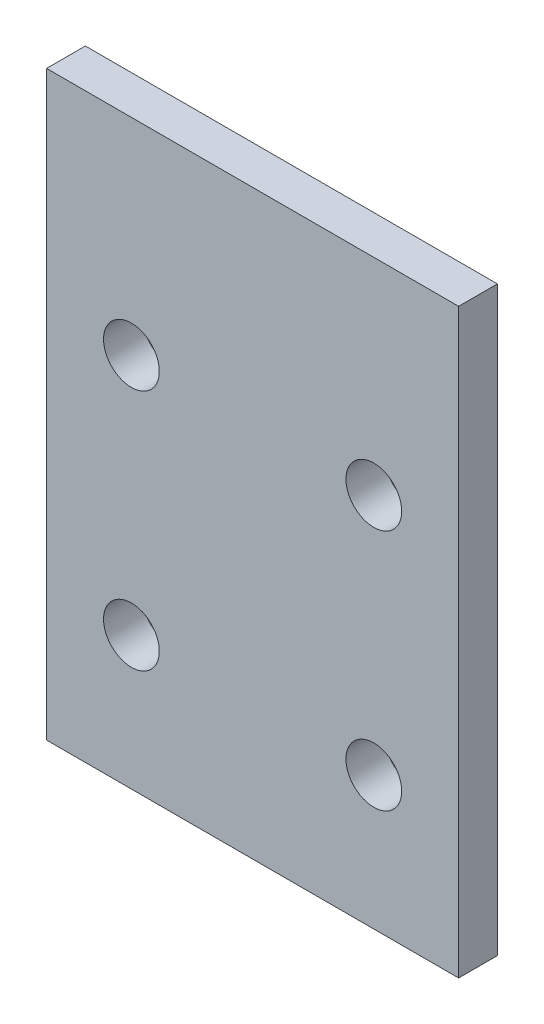
ISO-10303-21;
HEADER;
FILE_DESCRIPTION(('STEP AP214'),'2;1');
FILE_NAME('part.step','',(''),(''),'','','');
FILE_SCHEMA(('AUTOMOTIVE_DESIGN { 1 0 10303 214 1 1 1 1 }'));
ENDSEC;
DATA;
#1=APPLICATION_CONTEXT('core data for automotive mechanical design processes');
#2=APPLICATION_PROTOCOL_DEFINITION('international standard','automotive_design',2000,#1);
#3=PRODUCT_CONTEXT('',#1,'mechanical');
#4=PRODUCT('Part','Part','',(#3));
#5=PRODUCT_RELATED_PRODUCT_CATEGORY('part','',(#4));
#6=PRODUCT_DEFINITION_FORMATION('','',#4);
#7=PRODUCT_DEFINITION_CONTEXT('part definition',#1,'design');
#8=PRODUCT_DEFINITION('design','',#6,#7);
#9=PRODUCT_DEFINITION_SHAPE('','',#8);
#10=(LENGTH_UNIT() NAMED_UNIT(*) SI_UNIT(.MILLI.,.METRE.));
#11=(NAMED_UNIT(*) PLANE_ANGLE_UNIT() SI_UNIT($,.RADIAN.));
#12=(NAMED_UNIT(*) SI_UNIT($,.STERADIAN.) SOLID_ANGLE_UNIT());
#13=UNCERTAINTY_MEASURE_WITH_UNIT(LENGTH_MEASURE(1.E-05),#10,'distance_accuracy_value','');
#14=(GEOMETRIC_REPRESENTATION_CONTEXT(3) GLOBAL_UNCERTAINTY_ASSIGNED_CONTEXT((#13)) GLOBAL_UNIT_ASSIGNED_CONTEXT((#10,
#11,#12)) REPRESENTATION_CONTEXT('',''));
#15=CARTESIAN_POINT('',(0.,0.,0.));
#16=DIRECTION('',(0.,0.,1.));
#17=DIRECTION('',(1.,0.,0.));
#18=AXIS2_PLACEMENT_3D('',#15,#16,#17);
#19=CARTESIAN_POINT('',(0.,0.,-16.));
#20=DIRECTION('',(-1.,0.,0.));
#21=DIRECTION('',(0.,0.,1.));
#22=AXIS2_PLACEMENT_3D('',#19,#20,#21);
#23=PLANE('',#22);
#24=DIRECTION('',(0.,-1.,0.));
#25=VECTOR('',#24,1.);
#26=CARTESIAN_POINT('',(0.,0.,0.));
#27=LINE('',#26,#25);
#28=CARTESIAN_POINT('',(0.,0.,0.));
#29=VERTEX_POINT('',#28);
#30=CARTESIAN_POINT('',(0.,-240.,0.));
#31=VERTEX_POINT('',#30);
#32=EDGE_CURVE('E103',#29,#31,#27,.T.);
#33=ORIENTED_EDGE('',*,*,#32,.F.);
#34=DIRECTION('',(0.,0.,1.));
#35=VECTOR('',#34,1.);
#36=CARTESIAN_POINT('',(0.,0.,-16.));
#37=LINE('',#36,#35);
#38=CARTESIAN_POINT('',(0.,0.,-16.));
#39=VERTEX_POINT('',#38);
#40=EDGE_CURVE('E11',#39,#29,#37,.T.);
#41=ORIENTED_EDGE('',*,*,#40,.F.);
#42=DIRECTION('',(0.,-1.,0.));
#43=VECTOR('',#42,1.);
#44=CARTESIAN_POINT('',(0.,0.,-16.));
#45=LINE('',#44,#43);
#46=CARTESIAN_POINT('',(0.,-240.,-16.));
#47=VERTEX_POINT('',#46);
#48=EDGE_CURVE('E96',#39,#47,#45,.T.);
#49=ORIENTED_EDGE('',*,*,#48,.T.);
#50=DIRECTION('',(0.,0.,1.));
#51=VECTOR('',#50,1.);
#52=CARTESIAN_POINT('',(0.,-240.,-16.));
#53=LINE('',#52,#51);
#54=EDGE_CURVE('E41',#47,#31,#53,.T.);
#55=ORIENTED_EDGE('',*,*,#54,.T.);
#56=EDGE_LOOP('',(#33,#41,#49,#55));
#57=FACE_BOUND('',#56,.T.);
#58=ADVANCED_FACE('F38',(#57),#23,.T.);
#59=CARTESIAN_POINT('',(0.,0.,-16.));
#60=DIRECTION('',(0.,1.,0.));
#61=DIRECTION('',(0.,0.,1.));
#62=AXIS2_PLACEMENT_3D('',#59,#60,#61);
#63=PLANE('',#62);
#64=DIRECTION('',(-1.,0.,0.));
#65=VECTOR('',#64,1.);
#66=CARTESIAN_POINT('',(0.,0.,0.));
#67=LINE('',#66,#65);
#68=CARTESIAN_POINT('',(170.,0.,0.));
#69=VERTEX_POINT('',#68);
#70=EDGE_CURVE('E98',#69,#29,#67,.T.);
#71=ORIENTED_EDGE('',*,*,#70,.F.);
#72=DIRECTION('',(0.,0.,1.));
#73=VECTOR('',#72,1.);
#74=CARTESIAN_POINT('',(170.,0.,-16.));
#75=LINE('',#74,#73);
#76=CARTESIAN_POINT('',(170.,0.,-16.));
#77=VERTEX_POINT('',#76);
#78=EDGE_CURVE('E47',#77,#69,#75,.T.);
#79=ORIENTED_EDGE('',*,*,#78,.F.);
#80=DIRECTION('',(-1.,0.,0.));
#81=VECTOR('',#80,1.);
#82=CARTESIAN_POINT('',(0.,0.,-16.));
#83=LINE('',#82,#81);
#84=EDGE_CURVE('E93',#77,#39,#83,.T.);
#85=ORIENTED_EDGE('',*,*,#84,.T.);
#86=ORIENTED_EDGE('',*,*,#40,.T.);
#87=EDGE_LOOP('',(#71,#79,#85,#86));
#88=FACE_BOUND('',#87,.T.);
#89=ADVANCED_FACE('F114',(#88),#63,.T.);
#90=CARTESIAN_POINT('',(170.,0.,-16.));
#91=DIRECTION('',(1.,0.,0.));
#92=DIRECTION('',(0.,0.,-1.));
#93=AXIS2_PLACEMENT_3D('',#90,#91,#92);
#94=PLANE('',#93);
#95=DIRECTION('',(0.,1.,0.));
#96=VECTOR('',#95,1.);
#97=CARTESIAN_POINT('',(170.,0.,0.));
#98=LINE('',#97,#96);
#99=CARTESIAN_POINT('',(170.,-240.,0.));
#100=VERTEX_POINT('',#99);
#101=EDGE_CURVE('E88',#100,#69,#98,.T.);
#102=ORIENTED_EDGE('',*,*,#101,.F.);
#103=DIRECTION('',(0.,0.,1.));
#104=VECTOR('',#103,1.);
#105=CARTESIAN_POINT('',(170.,-240.,-16.));
#106=LINE('',#105,#104);
#107=CARTESIAN_POINT('',(170.,-240.,-16.));
#108=VERTEX_POINT('',#107);
#109=EDGE_CURVE('E83',#108,#100,#106,.T.);
#110=ORIENTED_EDGE('',*,*,#109,.F.);
#111=DIRECTION('',(0.,1.,0.));
#112=VECTOR('',#111,1.);
#113=CARTESIAN_POINT('',(170.,0.,-16.));
#114=LINE('',#113,#112);
#115=EDGE_CURVE('E86',#108,#77,#114,.T.);
#116=ORIENTED_EDGE('',*,*,#115,.T.);
#117=ORIENTED_EDGE('',*,*,#78,.T.);
#118=EDGE_LOOP('',(#102,#110,#116,#117));
#119=FACE_BOUND('',#118,.T.);
#120=ADVANCED_FACE('F85',(#119),#94,.T.);
#121=CARTESIAN_POINT('',(0.,-240.,-16.));
#122=DIRECTION('',(0.,-1.,0.));
#123=DIRECTION('',(0.,0.,-1.));
#124=AXIS2_PLACEMENT_3D('',#121,#122,#123);
#125=PLANE('',#124);
#126=DIRECTION('',(1.,0.,0.));
#127=VECTOR('',#126,1.);
#128=CARTESIAN_POINT('',(0.,-240.,0.));
#129=LINE('',#128,#127);
#130=EDGE_CURVE('E106',#31,#100,#129,.T.);
#131=ORIENTED_EDGE('',*,*,#130,.F.);
#132=ORIENTED_EDGE('',*,*,#54,.F.);
#133=DIRECTION('',(1.,0.,0.));
#134=VECTOR('',#133,1.);
#135=CARTESIAN_POINT('',(0.,-240.,-16.));
#136=LINE('',#135,#134);
#137=EDGE_CURVE('E92',#47,#108,#136,.T.);
#138=ORIENTED_EDGE('',*,*,#137,.T.);
#139=ORIENTED_EDGE('',*,*,#109,.T.);
#140=EDGE_LOOP('',(#131,#132,#138,#139));
#141=FACE_BOUND('',#140,.T.);
#142=ADVANCED_FACE('F95',(#141),#125,.T.);
#143=CARTESIAN_POINT('',(0.,0.,-16.));
#144=DIRECTION('',(0.,0.,1.));
#145=DIRECTION('',(1.,0.,0.));
#146=AXIS2_PLACEMENT_3D('',#143,#144,#145);
#147=PLANE('',#146);
#148=CARTESIAN_POINT('',(34.9999999999996,-185.,-16.));
#149=DIRECTION('',(0.,0.,1.));
#150=DIRECTION('',(-1.,0.,0.));
#151=AXIS2_PLACEMENT_3D('',#148,#149,#150);
#152=CIRCLE('',#151,11.5);
#153=CARTESIAN_POINT('',(23.4999999999996,-185.,-16.));
#154=VERTEX_POINT('',#153);
#155=EDGE_CURVE('E155',#154,#154,#152,.T.);
#156=ORIENTED_EDGE('',*,*,#155,.T.);
#157=EDGE_LOOP('',(#156));
#158=FACE_BOUND('',#157,.T.);
#159=CARTESIAN_POINT('',(35.,-85.,-16.));
#160=DIRECTION('',(0.,0.,1.));
#161=DIRECTION('',(-1.,0.,0.));
#162=AXIS2_PLACEMENT_3D('',#159,#160,#161);
#163=CIRCLE('',#162,11.5);
#164=CARTESIAN_POINT('',(23.5,-85.,-16.));
#165=VERTEX_POINT('',#164);
#166=EDGE_CURVE('E163',#165,#165,#163,.T.);
#167=ORIENTED_EDGE('',*,*,#166,.T.);
#168=EDGE_LOOP('',(#167));
#169=FACE_BOUND('',#168,.T.);
#170=CARTESIAN_POINT('',(135.,-85.,-16.));
#171=DIRECTION('',(0.,0.,1.));
#172=DIRECTION('',(1.,0.,0.));
#173=AXIS2_PLACEMENT_3D('',#170,#171,#172);
#174=CIRCLE('',#173,11.5);
#175=CARTESIAN_POINT('',(146.5,-85.,-16.));
#176=VERTEX_POINT('',#175);
#177=EDGE_CURVE('E169',#176,#176,#174,.T.);
#178=ORIENTED_EDGE('',*,*,#177,.T.);
#179=EDGE_LOOP('',(#178));
#180=FACE_BOUND('',#179,.T.);
#181=CARTESIAN_POINT('',(135.,-185.,-16.));
#182=DIRECTION('',(0.,0.,1.));
#183=DIRECTION('',(1.,0.,0.));
#184=AXIS2_PLACEMENT_3D('',#181,#182,#183);
#185=CIRCLE('',#184,11.5);
#186=CARTESIAN_POINT('',(146.5,-185.,-16.));
#187=VERTEX_POINT('',#186);
#188=EDGE_CURVE('E107',#187,#187,#185,.T.);
#189=ORIENTED_EDGE('',*,*,#188,.T.);
#190=EDGE_LOOP('',(#189));
#191=FACE_BOUND('',#190,.T.);
#192=ORIENTED_EDGE('',*,*,#48,.F.);
#193=ORIENTED_EDGE('',*,*,#84,.F.);
#194=ORIENTED_EDGE('',*,*,#115,.F.);
#195=ORIENTED_EDGE('',*,*,#137,.F.);
#196=EDGE_LOOP('',(#192,#193,#194,#195));
#197=FACE_BOUND('',#196,.T.);
#198=ADVANCED_FACE('F91',(#158,#169,#180,#191,#197),#147,.F.);
#199=CARTESIAN_POINT('',(0.,0.,0.));
#200=DIRECTION('',(0.,0.,1.));
#201=DIRECTION('',(1.,0.,0.));
#202=AXIS2_PLACEMENT_3D('',#199,#200,#201);
#203=PLANE('',#202);
#204=CARTESIAN_POINT('',(34.9999999999996,-185.,0.));
#205=DIRECTION('',(0.,0.,1.));
#206=DIRECTION('',(-1.,0.,0.));
#207=AXIS2_PLACEMENT_3D('',#204,#205,#206);
#208=CIRCLE('',#207,11.5);
#209=CARTESIAN_POINT('',(23.4999999999996,-185.,0.));
#210=VERTEX_POINT('',#209);
#211=EDGE_CURVE('E158',#210,#210,#208,.T.);
#212=ORIENTED_EDGE('',*,*,#211,.F.);
#213=EDGE_LOOP('',(#212));
#214=FACE_BOUND('',#213,.T.);
#215=CARTESIAN_POINT('',(35.,-85.,0.));
#216=DIRECTION('',(0.,0.,1.));
#217=DIRECTION('',(-1.,0.,0.));
#218=AXIS2_PLACEMENT_3D('',#215,#216,#217);
#219=CIRCLE('',#218,11.5);
#220=CARTESIAN_POINT('',(23.5,-85.,0.));
#221=VERTEX_POINT('',#220);
#222=EDGE_CURVE('E160',#221,#221,#219,.T.);
#223=ORIENTED_EDGE('',*,*,#222,.F.);
#224=EDGE_LOOP('',(#223));
#225=FACE_BOUND('',#224,.T.);
#226=CARTESIAN_POINT('',(135.,-85.,0.));
#227=DIRECTION('',(0.,0.,1.));
#228=DIRECTION('',(1.,0.,0.));
#229=AXIS2_PLACEMENT_3D('',#226,#227,#228);
#230=CIRCLE('',#229,11.5);
#231=CARTESIAN_POINT('',(146.5,-85.,0.));
#232=VERTEX_POINT('',#231);
#233=EDGE_CURVE('E166',#232,#232,#230,.T.);
#234=ORIENTED_EDGE('',*,*,#233,.F.);
#235=EDGE_LOOP('',(#234));
#236=FACE_BOUND('',#235,.T.);
#237=CARTESIAN_POINT('',(135.,-185.,0.));
#238=DIRECTION('',(0.,0.,1.));
#239=DIRECTION('',(1.,0.,0.));
#240=AXIS2_PLACEMENT_3D('',#237,#238,#239);
#241=CIRCLE('',#240,11.5);
#242=CARTESIAN_POINT('',(146.5,-185.,0.));
#243=VERTEX_POINT('',#242);
#244=EDGE_CURVE('E172',#243,#243,#241,.T.);
#245=ORIENTED_EDGE('',*,*,#244,.F.);
#246=EDGE_LOOP('',(#245));
#247=FACE_BOUND('',#246,.T.);
#248=ORIENTED_EDGE('',*,*,#32,.T.);
#249=ORIENTED_EDGE('',*,*,#130,.T.);
#250=ORIENTED_EDGE('',*,*,#101,.T.);
#251=ORIENTED_EDGE('',*,*,#70,.T.);
#252=EDGE_LOOP('',(#248,#249,#250,#251));
#253=FACE_BOUND('',#252,.T.);
#254=ADVANCED_FACE('F113',(#214,#225,#236,#247,#253),#203,.T.);
#255=CARTESIAN_POINT('',(135.,-185.,-16.));
#256=DIRECTION('',(0.,0.,1.));
#257=DIRECTION('',(1.,0.,0.));
#258=AXIS2_PLACEMENT_3D('',#255,#256,#257);
#259=CYLINDRICAL_SURFACE('',#258,11.5);
#260=ORIENTED_EDGE('',*,*,#188,.F.);
#261=EDGE_LOOP('',(#260));
#262=FACE_BOUND('',#261,.T.);
#263=ORIENTED_EDGE('',*,*,#244,.T.);
#264=EDGE_LOOP('',(#263));
#265=FACE_BOUND('',#264,.T.);
#266=ADVANCED_FACE('F132',(#262,#265),#259,.F.);
#267=CARTESIAN_POINT('',(135.,-85.,-16.));
#268=DIRECTION('',(0.,0.,1.));
#269=DIRECTION('',(1.,0.,0.));
#270=AXIS2_PLACEMENT_3D('',#267,#268,#269);
#271=CYLINDRICAL_SURFACE('',#270,11.5);
#272=ORIENTED_EDGE('',*,*,#177,.F.);
#273=EDGE_LOOP('',(#272));
#274=FACE_BOUND('',#273,.T.);
#275=ORIENTED_EDGE('',*,*,#233,.T.);
#276=EDGE_LOOP('',(#275));
#277=FACE_BOUND('',#276,.T.);
#278=ADVANCED_FACE('F139',(#274,#277),#271,.F.);
#279=CARTESIAN_POINT('',(35.,-85.,-16.));
#280=DIRECTION('',(0.,0.,1.));
#281=DIRECTION('',(1.,0.,0.));
#282=AXIS2_PLACEMENT_3D('',#279,#280,#281);
#283=CYLINDRICAL_SURFACE('',#282,11.5);
#284=ORIENTED_EDGE('',*,*,#166,.F.);
#285=EDGE_LOOP('',(#284));
#286=FACE_BOUND('',#285,.T.);
#287=ORIENTED_EDGE('',*,*,#222,.T.);
#288=EDGE_LOOP('',(#287));
#289=FACE_BOUND('',#288,.T.);
#290=ADVANCED_FACE('F143',(#286,#289),#283,.F.);
#291=CARTESIAN_POINT('',(34.9999999999996,-185.,-16.));
#292=DIRECTION('',(0.,0.,1.));
#293=DIRECTION('',(1.,0.,0.));
#294=AXIS2_PLACEMENT_3D('',#291,#292,#293);
#295=CYLINDRICAL_SURFACE('',#294,11.5);
#296=ORIENTED_EDGE('',*,*,#155,.F.);
#297=EDGE_LOOP('',(#296));
#298=FACE_BOUND('',#297,.T.);
#299=ORIENTED_EDGE('',*,*,#211,.T.);
#300=EDGE_LOOP('',(#299));
#301=FACE_BOUND('',#300,.T.);
#302=ADVANCED_FACE('F147',(#298,#301),#295,.F.);
#303=CLOSED_SHELL('',(#58,#89,#120,#142,#198,#254,#266,#278,#290,#302));
#304=MANIFOLD_SOLID_BREP('B2',#303);
#305=ADVANCED_BREP_SHAPE_REPRESENTATION('',(#18,#304),#14);
#306=SHAPE_DEFINITION_REPRESENTATION(#9,#305);
ENDSEC;
END-ISO-10303-21;
